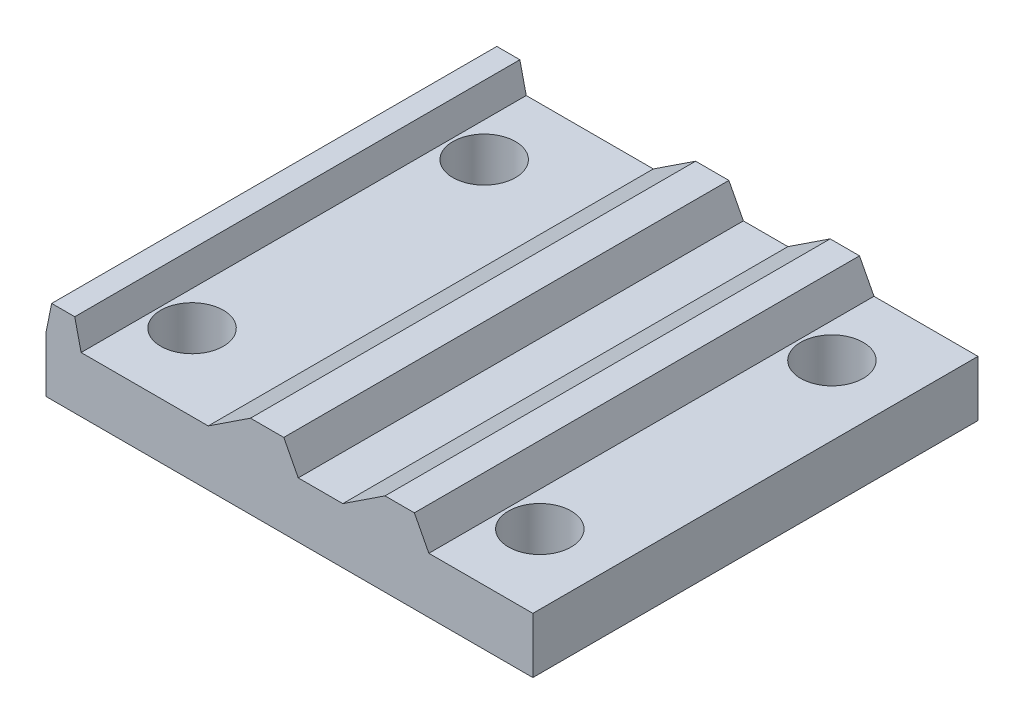
ISO-10303-21;
HEADER;
FILE_DESCRIPTION(('STEP AP214'),'2;1');
FILE_NAME('part.step','',(''),(''),'','','');
FILE_SCHEMA(('AUTOMOTIVE_DESIGN { 1 0 10303 214 1 1 1 1 }'));
ENDSEC;
DATA;
#1=APPLICATION_CONTEXT('core data for automotive mechanical design processes');
#2=APPLICATION_PROTOCOL_DEFINITION('international standard','automotive_design',2000,#1);
#3=PRODUCT_CONTEXT('',#1,'mechanical');
#4=PRODUCT('Part','Part','',(#3));
#5=PRODUCT_RELATED_PRODUCT_CATEGORY('part','',(#4));
#6=PRODUCT_DEFINITION_FORMATION('','',#4);
#7=PRODUCT_DEFINITION_CONTEXT('part definition',#1,'design');
#8=PRODUCT_DEFINITION('design','',#6,#7);
#9=PRODUCT_DEFINITION_SHAPE('','',#8);
#10=(LENGTH_UNIT() NAMED_UNIT(*) SI_UNIT(.MILLI.,.METRE.));
#11=(NAMED_UNIT(*) PLANE_ANGLE_UNIT() SI_UNIT($,.RADIAN.));
#12=(NAMED_UNIT(*) SI_UNIT($,.STERADIAN.) SOLID_ANGLE_UNIT());
#13=UNCERTAINTY_MEASURE_WITH_UNIT(LENGTH_MEASURE(1.E-05),#10,'distance_accuracy_value','');
#14=(GEOMETRIC_REPRESENTATION_CONTEXT(3) GLOBAL_UNCERTAINTY_ASSIGNED_CONTEXT((#13)) GLOBAL_UNIT_ASSIGNED_CONTEXT((#10,
#11,#12)) REPRESENTATION_CONTEXT('',''));
#15=CARTESIAN_POINT('',(0.,0.,0.));
#16=DIRECTION('',(0.,0.,1.));
#17=DIRECTION('',(1.,0.,0.));
#18=AXIS2_PLACEMENT_3D('',#15,#16,#17);
#19=CARTESIAN_POINT('',(0.,4.,0.));
#20=DIRECTION('',(0.,-1.,0.));
#21=DIRECTION('',(0.,0.,-1.));
#22=AXIS2_PLACEMENT_3D('',#19,#20,#21);
#23=PLANE('',#22);
#24=DIRECTION('',(0.,0.,1.));
#25=VECTOR('',#24,1.);
#26=CARTESIAN_POINT('',(3.83657922988963,4.,-22.7733539795888));
#27=LINE('',#26,#25);
#28=CARTESIAN_POINT('',(3.83657922988963,4.,-16.));
#29=VERTEX_POINT('',#28);
#30=CARTESIAN_POINT('',(3.83657922988963,4.,16.));
#31=VERTEX_POINT('',#30);
#32=EDGE_CURVE('E196',#29,#31,#27,.T.);
#33=ORIENTED_EDGE('',*,*,#32,.F.);
#34=DIRECTION('',(-1.,0.,0.));
#35=VECTOR('',#34,1.);
#36=CARTESIAN_POINT('',(-17.5,4.,-16.));
#37=LINE('',#36,#35);
#38=CARTESIAN_POINT('',(0.634129455362189,4.,-16.));
#39=VERTEX_POINT('',#38);
#40=EDGE_CURVE('E308',#29,#39,#37,.T.);
#41=ORIENTED_EDGE('',*,*,#40,.T.);
#42=DIRECTION('',(0.,0.,1.));
#43=VECTOR('',#42,1.);
#44=CARTESIAN_POINT('',(0.634129455362189,4.,-22.7733539795888));
#45=LINE('',#44,#43);
#46=CARTESIAN_POINT('',(0.63412945536219,4.,16.));
#47=VERTEX_POINT('',#46);
#48=EDGE_CURVE('E219',#39,#47,#45,.T.);
#49=ORIENTED_EDGE('',*,*,#48,.T.);
#50=DIRECTION('',(1.,0.,0.));
#51=VECTOR('',#50,1.);
#52=CARTESIAN_POINT('',(-17.5,4.,16.));
#53=LINE('',#52,#51);
#54=EDGE_CURVE('E313',#47,#31,#53,.T.);
#55=ORIENTED_EDGE('',*,*,#54,.T.);
#56=EDGE_LOOP('',(#33,#41,#49,#55));
#57=FACE_BOUND('',#56,.T.);
#58=ADVANCED_FACE('F48',(#57),#23,.F.);
#59=CARTESIAN_POINT('',(-12.5,4.,-10.5));
#60=DIRECTION('',(0.,1.,0.));
#61=DIRECTION('',(0.,0.,1.));
#62=AXIS2_PLACEMENT_3D('',#59,#60,#61);
#63=CIRCLE('',#62,2.25);
#64=CARTESIAN_POINT('',(-12.5,4.,-8.25));
#65=VERTEX_POINT('',#64);
#66=EDGE_CURVE('E289',#65,#65,#63,.T.);
#67=ORIENTED_EDGE('',*,*,#66,.F.);
#68=EDGE_LOOP('',(#67));
#69=FACE_BOUND('',#68,.T.);
#70=CARTESIAN_POINT('',(-12.5,4.,10.5));
#71=DIRECTION('',(0.,1.,0.));
#72=DIRECTION('',(0.,0.,-1.));
#73=AXIS2_PLACEMENT_3D('',#70,#71,#72);
#74=CIRCLE('',#73,2.25);
#75=CARTESIAN_POINT('',(-12.5,4.,8.25));
#76=VERTEX_POINT('',#75);
#77=EDGE_CURVE('E281',#76,#76,#74,.T.);
#78=ORIENTED_EDGE('',*,*,#77,.F.);
#79=EDGE_LOOP('',(#78));
#80=FACE_BOUND('',#79,.T.);
#81=DIRECTION('',(0.,0.,1.));
#82=VECTOR('',#81,1.);
#83=CARTESIAN_POINT('',(-5.83721693722193,4.,-22.7733539795888));
#84=LINE('',#83,#82);
#85=CARTESIAN_POINT('',(-5.83721693722193,4.,-16.));
#86=VERTEX_POINT('',#85);
#87=CARTESIAN_POINT('',(-5.83721693722193,4.,16.));
#88=VERTEX_POINT('',#87);
#89=EDGE_CURVE('E222',#86,#88,#84,.T.);
#90=ORIENTED_EDGE('',*,*,#89,.F.);
#91=CARTESIAN_POINT('',(-14.9752109843227,4.,-16.));
#92=VERTEX_POINT('',#91);
#93=EDGE_CURVE('E301',#86,#92,#37,.T.);
#94=ORIENTED_EDGE('',*,*,#93,.T.);
#95=DIRECTION('',(0.,0.,1.));
#96=VECTOR('',#95,1.);
#97=CARTESIAN_POINT('',(-14.9752109843227,4.,-22.7733539795888));
#98=LINE('',#97,#96);
#99=CARTESIAN_POINT('',(-14.9752109843227,4.,16.));
#100=VERTEX_POINT('',#99);
#101=EDGE_CURVE('E252',#92,#100,#98,.T.);
#102=ORIENTED_EDGE('',*,*,#101,.T.);
#103=EDGE_CURVE('E314',#100,#88,#53,.T.);
#104=ORIENTED_EDGE('',*,*,#103,.T.);
#105=EDGE_LOOP('',(#90,#94,#102,#104));
#106=FACE_BOUND('',#105,.T.);
#107=ADVANCED_FACE('F371',(#69,#80,#106),#23,.F.);
#108=CARTESIAN_POINT('',(17.5,4.,-16.));
#109=VERTEX_POINT('',#108);
#110=CARTESIAN_POINT('',(10.0231415723249,4.,-16.));
#111=VERTEX_POINT('',#110);
#112=EDGE_CURVE('E303',#109,#111,#37,.T.);
#113=ORIENTED_EDGE('',*,*,#112,.T.);
#114=DIRECTION('',(0.,0.,1.));
#115=VECTOR('',#114,1.);
#116=CARTESIAN_POINT('',(10.0231415723249,4.,-22.7733539795888));
#117=LINE('',#116,#115);
#118=CARTESIAN_POINT('',(10.0231415723249,4.,16.));
#119=VERTEX_POINT('',#118);
#120=EDGE_CURVE('E192',#111,#119,#117,.T.);
#121=ORIENTED_EDGE('',*,*,#120,.T.);
#122=CARTESIAN_POINT('',(17.5,4.,16.));
#123=VERTEX_POINT('',#122);
#124=EDGE_CURVE('E179',#119,#123,#53,.T.);
#125=ORIENTED_EDGE('',*,*,#124,.T.);
#126=DIRECTION('',(0.,0.,-1.));
#127=VECTOR('',#126,1.);
#128=CARTESIAN_POINT('',(17.5,4.,16.));
#129=LINE('',#128,#127);
#130=EDGE_CURVE('E297',#123,#109,#129,.T.);
#131=ORIENTED_EDGE('',*,*,#130,.T.);
#132=EDGE_LOOP('',(#113,#121,#125,#131));
#133=FACE_BOUND('',#132,.T.);
#134=CARTESIAN_POINT('',(12.5,4.,10.5));
#135=DIRECTION('',(0.,1.,0.));
#136=DIRECTION('',(0.,0.,1.));
#137=AXIS2_PLACEMENT_3D('',#134,#135,#136);
#138=CIRCLE('',#137,2.25);
#139=CARTESIAN_POINT('',(12.5,4.,12.75));
#140=VERTEX_POINT('',#139);
#141=EDGE_CURVE('E273',#140,#140,#138,.T.);
#142=ORIENTED_EDGE('',*,*,#141,.F.);
#143=EDGE_LOOP('',(#142));
#144=FACE_BOUND('',#143,.T.);
#145=CARTESIAN_POINT('',(12.5,4.,-10.5));
#146=DIRECTION('',(0.,1.,0.));
#147=DIRECTION('',(0.,0.,-1.));
#148=AXIS2_PLACEMENT_3D('',#145,#146,#147);
#149=CIRCLE('',#148,2.25);
#150=CARTESIAN_POINT('',(12.5,4.,-12.75));
#151=VERTEX_POINT('',#150);
#152=EDGE_CURVE('E264',#151,#151,#149,.T.);
#153=ORIENTED_EDGE('',*,*,#152,.F.);
#154=EDGE_LOOP('',(#153));
#155=FACE_BOUND('',#154,.T.);
#156=ADVANCED_FACE('F352',(#133,#144,#155),#23,.F.);
#157=CARTESIAN_POINT('',(0.,0.,0.));
#158=DIRECTION('',(0.,-1.,0.));
#159=DIRECTION('',(0.,0.,-1.));
#160=AXIS2_PLACEMENT_3D('',#157,#158,#159);
#161=PLANE('',#160);
#162=CARTESIAN_POINT('',(12.5,0.,10.5));
#163=DIRECTION('',(0.,1.,0.));
#164=DIRECTION('',(0.,0.,1.));
#165=AXIS2_PLACEMENT_3D('',#162,#163,#164);
#166=CIRCLE('',#165,2.25);
#167=CARTESIAN_POINT('',(12.5,0.,12.75));
#168=VERTEX_POINT('',#167);
#169=EDGE_CURVE('E268',#168,#168,#166,.T.);
#170=ORIENTED_EDGE('',*,*,#169,.T.);
#171=EDGE_LOOP('',(#170));
#172=FACE_BOUND('',#171,.T.);
#173=CARTESIAN_POINT('',(-12.5,0.,-10.5));
#174=DIRECTION('',(0.,1.,0.));
#175=DIRECTION('',(0.,0.,1.));
#176=AXIS2_PLACEMENT_3D('',#173,#174,#175);
#177=CIRCLE('',#176,2.25);
#178=CARTESIAN_POINT('',(-12.5,0.,-8.25));
#179=VERTEX_POINT('',#178);
#180=EDGE_CURVE('E285',#179,#179,#177,.T.);
#181=ORIENTED_EDGE('',*,*,#180,.T.);
#182=EDGE_LOOP('',(#181));
#183=FACE_BOUND('',#182,.T.);
#184=DIRECTION('',(0.,0.,-1.));
#185=VECTOR('',#184,1.);
#186=CARTESIAN_POINT('',(17.5,0.,16.));
#187=LINE('',#186,#185);
#188=CARTESIAN_POINT('',(17.5,0.,16.));
#189=VERTEX_POINT('',#188);
#190=CARTESIAN_POINT('',(17.5,0.,-16.));
#191=VERTEX_POINT('',#190);
#192=EDGE_CURVE('E293',#189,#191,#187,.T.);
#193=ORIENTED_EDGE('',*,*,#192,.F.);
#194=DIRECTION('',(1.,0.,0.));
#195=VECTOR('',#194,1.);
#196=CARTESIAN_POINT('',(-17.5,0.,16.));
#197=LINE('',#196,#195);
#198=CARTESIAN_POINT('',(-17.5,0.,16.));
#199=VERTEX_POINT('',#198);
#200=EDGE_CURVE('E302',#199,#189,#197,.T.);
#201=ORIENTED_EDGE('',*,*,#200,.F.);
#202=DIRECTION('',(0.,0.,1.));
#203=VECTOR('',#202,1.);
#204=CARTESIAN_POINT('',(-17.5,0.,16.));
#205=LINE('',#204,#203);
#206=CARTESIAN_POINT('',(-17.5,0.,-16.));
#207=VERTEX_POINT('',#206);
#208=EDGE_CURVE('E321',#207,#199,#205,.T.);
#209=ORIENTED_EDGE('',*,*,#208,.F.);
#210=DIRECTION('',(-1.,0.,0.));
#211=VECTOR('',#210,1.);
#212=CARTESIAN_POINT('',(-17.5,0.,-16.));
#213=LINE('',#212,#211);
#214=EDGE_CURVE('E318',#191,#207,#213,.T.);
#215=ORIENTED_EDGE('',*,*,#214,.F.);
#216=EDGE_LOOP('',(#193,#201,#209,#215));
#217=FACE_BOUND('',#216,.T.);
#218=CARTESIAN_POINT('',(-12.5,0.,10.5));
#219=DIRECTION('',(0.,1.,0.));
#220=DIRECTION('',(0.,0.,-1.));
#221=AXIS2_PLACEMENT_3D('',#218,#219,#220);
#222=CIRCLE('',#221,2.25);
#223=CARTESIAN_POINT('',(-12.5,0.,8.25));
#224=VERTEX_POINT('',#223);
#225=EDGE_CURVE('E277',#224,#224,#222,.T.);
#226=ORIENTED_EDGE('',*,*,#225,.T.);
#227=EDGE_LOOP('',(#226));
#228=FACE_BOUND('',#227,.T.);
#229=CARTESIAN_POINT('',(12.5,0.,-10.5));
#230=DIRECTION('',(0.,1.,0.));
#231=DIRECTION('',(0.,0.,-1.));
#232=AXIS2_PLACEMENT_3D('',#229,#230,#231);
#233=CIRCLE('',#232,2.25);
#234=CARTESIAN_POINT('',(12.5,0.,-12.75));
#235=VERTEX_POINT('',#234);
#236=EDGE_CURVE('E269',#235,#235,#233,.T.);
#237=ORIENTED_EDGE('',*,*,#236,.T.);
#238=EDGE_LOOP('',(#237));
#239=FACE_BOUND('',#238,.T.);
#240=ADVANCED_FACE('F345',(#172,#183,#217,#228,#239),#161,.T.);
#241=CARTESIAN_POINT('',(17.5,4.,16.));
#242=DIRECTION('',(-1.,0.,0.));
#243=DIRECTION('',(0.,0.,1.));
#244=AXIS2_PLACEMENT_3D('',#241,#242,#243);
#245=PLANE('',#244);
#246=ORIENTED_EDGE('',*,*,#192,.T.);
#247=DIRECTION('',(0.,-1.,0.));
#248=VECTOR('',#247,1.);
#249=CARTESIAN_POINT('',(17.5,4.,-16.));
#250=LINE('',#249,#248);
#251=EDGE_CURVE('E11',#109,#191,#250,.T.);
#252=ORIENTED_EDGE('',*,*,#251,.F.);
#253=ORIENTED_EDGE('',*,*,#130,.F.);
#254=DIRECTION('',(0.,-1.,0.));
#255=VECTOR('',#254,1.);
#256=CARTESIAN_POINT('',(17.5,4.,16.));
#257=LINE('',#256,#255);
#258=EDGE_CURVE('E326',#123,#189,#257,.T.);
#259=ORIENTED_EDGE('',*,*,#258,.T.);
#260=EDGE_LOOP('',(#246,#252,#253,#259));
#261=FACE_BOUND('',#260,.T.);
#262=ADVANCED_FACE('F50',(#261),#245,.F.);
#263=CARTESIAN_POINT('',(-17.5,4.,-16.));
#264=DIRECTION('',(0.,0.,1.));
#265=DIRECTION('',(1.,0.,0.));
#266=AXIS2_PLACEMENT_3D('',#263,#264,#265);
#267=PLANE('',#266);
#268=ORIENTED_EDGE('',*,*,#214,.T.);
#269=DIRECTION('',(0.,-1.,0.));
#270=VECTOR('',#269,1.);
#271=CARTESIAN_POINT('',(-17.5,4.,-16.));
#272=LINE('',#271,#270);
#273=CARTESIAN_POINT('',(-17.5,4.,-16.));
#274=VERTEX_POINT('',#273);
#275=EDGE_CURVE('E57',#274,#207,#272,.T.);
#276=ORIENTED_EDGE('',*,*,#275,.F.);
#277=DIRECTION('',(-0.199963550905367,-0.979803336547348,0.));
#278=VECTOR('',#277,1.);
#279=CARTESIAN_POINT('',(-17.5839549378728,3.58862838814909,-16.));
#280=LINE('',#279,#278);
#281=CARTESIAN_POINT('',(-17.0918292101148,6.,-16.));
#282=VERTEX_POINT('',#281);
#283=EDGE_CURVE('E233',#282,#274,#280,.T.);
#284=ORIENTED_EDGE('',*,*,#283,.F.);
#285=DIRECTION('',(-1.,0.,0.));
#286=VECTOR('',#285,1.);
#287=CARTESIAN_POINT('',(0.,6.,-16.));
#288=LINE('',#287,#286);
#289=CARTESIAN_POINT('',(-15.4333367883982,6.,-16.));
#290=VERTEX_POINT('',#289);
#291=EDGE_CURVE('E236',#290,#282,#288,.T.);
#292=ORIENTED_EDGE('',*,*,#291,.F.);
#293=DIRECTION('',(-0.223280057045609,0.974754336294899,0.));
#294=VECTOR('',#293,1.);
#295=CARTESIAN_POINT('',(-13.3580642421427,-3.05983696091214,-16.));
#296=LINE('',#295,#294);
#297=EDGE_CURVE('E210',#92,#290,#296,.T.);
#298=ORIENTED_EDGE('',*,*,#297,.F.);
#299=ORIENTED_EDGE('',*,*,#93,.F.);
#300=DIRECTION('',(-0.835107840595722,-0.550086261031441,0.));
#301=VECTOR('',#300,1.);
#302=CARTESIAN_POINT('',(-3.60383744209866,5.47112901617624,-16.));
#303=LINE('',#302,#301);
#304=CARTESIAN_POINT('',(-2.80093735797976,6.,-16.));
#305=VERTEX_POINT('',#304);
#306=EDGE_CURVE('E185',#305,#86,#303,.T.);
#307=ORIENTED_EDGE('',*,*,#306,.F.);
#308=DIRECTION('',(-1.,0.,0.));
#309=VECTOR('',#308,1.);
#310=CARTESIAN_POINT('',(0.,6.,-16.));
#311=LINE('',#310,#309);
#312=CARTESIAN_POINT('',(-0.407144499746946,6.,-16.));
#313=VERTEX_POINT('',#312);
#314=EDGE_CURVE('E205',#313,#305,#311,.T.);
#315=ORIENTED_EDGE('',*,*,#314,.F.);
#316=DIRECTION('',(-0.461797412471633,0.886985428197389,0.));
#317=VECTOR('',#316,1.);
#318=CARTESIAN_POINT('',(2.13732730768088,1.11277162951581,-16.));
#319=LINE('',#318,#317);
#320=EDGE_CURVE('E181',#39,#313,#319,.T.);
#321=ORIENTED_EDGE('',*,*,#320,.F.);
#322=ORIENTED_EDGE('',*,*,#40,.F.);
#323=DIRECTION('',(-0.835107840595722,-0.550086261031441,0.));
#324=VECTOR('',#323,1.);
#325=CARTESIAN_POINT('',(-0.676596110766165,1.02716747725699,-16.));
#326=LINE('',#325,#324);
#327=CARTESIAN_POINT('',(6.8728588091318,6.,-16.));
#328=VERTEX_POINT('',#327);
#329=EDGE_CURVE('E203',#328,#29,#326,.T.);
#330=ORIENTED_EDGE('',*,*,#329,.F.);
#331=DIRECTION('',(-1.,0.,0.));
#332=VECTOR('',#331,1.);
#333=CARTESIAN_POINT('',(0.,6.,-16.));
#334=LINE('',#333,#332);
#335=CARTESIAN_POINT('',(8.98186761721576,6.,-16.));
#336=VERTEX_POINT('',#335);
#337=EDGE_CURVE('E195',#336,#328,#334,.T.);
#338=ORIENTED_EDGE('',*,*,#337,.F.);
#339=DIRECTION('',(-0.461797412471633,0.886985428197389,0.));
#340=VECTOR('',#339,1.);
#341=CARTESIAN_POINT('',(9.52406827441444,4.95858212041449,-16.));
#342=LINE('',#341,#340);
#343=EDGE_CURVE('E160',#111,#336,#342,.T.);
#344=ORIENTED_EDGE('',*,*,#343,.F.);
#345=ORIENTED_EDGE('',*,*,#112,.F.);
#346=ORIENTED_EDGE('',*,*,#251,.T.);
#347=EDGE_LOOP('',(#268,#276,#284,#292,#298,#299,#307,#315,#321,#322,#330,#338,#344,#345,#346));
#348=FACE_BOUND('',#347,.T.);
#349=ADVANCED_FACE('F354',(#348),#267,.F.);
#350=CARTESIAN_POINT('',(-17.5,4.,16.));
#351=DIRECTION('',(1.,0.,0.));
#352=DIRECTION('',(0.,0.,-1.));
#353=AXIS2_PLACEMENT_3D('',#350,#351,#352);
#354=PLANE('',#353);
#355=ORIENTED_EDGE('',*,*,#208,.T.);
#356=DIRECTION('',(0.,-1.,0.));
#357=VECTOR('',#356,1.);
#358=CARTESIAN_POINT('',(-17.5,4.,16.));
#359=LINE('',#358,#357);
#360=CARTESIAN_POINT('',(-17.5,4.,16.));
#361=VERTEX_POINT('',#360);
#362=EDGE_CURVE('E330',#361,#199,#359,.T.);
#363=ORIENTED_EDGE('',*,*,#362,.F.);
#364=DIRECTION('',(0.,0.,1.));
#365=VECTOR('',#364,1.);
#366=CARTESIAN_POINT('',(-17.5,4.,16.));
#367=LINE('',#366,#365);
#368=EDGE_CURVE('E307',#274,#361,#367,.T.);
#369=ORIENTED_EDGE('',*,*,#368,.F.);
#370=ORIENTED_EDGE('',*,*,#275,.T.);
#371=EDGE_LOOP('',(#355,#363,#369,#370));
#372=FACE_BOUND('',#371,.T.);
#373=ADVANCED_FACE('F339',(#372),#354,.F.);
#374=CARTESIAN_POINT('',(-17.5,4.,16.));
#375=DIRECTION('',(0.,0.,-1.));
#376=DIRECTION('',(-1.,0.,0.));
#377=AXIS2_PLACEMENT_3D('',#374,#375,#376);
#378=PLANE('',#377);
#379=ORIENTED_EDGE('',*,*,#200,.T.);
#380=ORIENTED_EDGE('',*,*,#258,.F.);
#381=ORIENTED_EDGE('',*,*,#124,.F.);
#382=DIRECTION('',(0.461797412471633,-0.886985428197389,0.));
#383=VECTOR('',#382,1.);
#384=CARTESIAN_POINT('',(9.52406827441444,4.95858212041449,16.));
#385=LINE('',#384,#383);
#386=CARTESIAN_POINT('',(8.98186761721576,6.,16.));
#387=VERTEX_POINT('',#386);
#388=EDGE_CURVE('E64',#387,#119,#385,.T.);
#389=ORIENTED_EDGE('',*,*,#388,.F.);
#390=DIRECTION('',(1.,0.,0.));
#391=VECTOR('',#390,1.);
#392=CARTESIAN_POINT('',(0.,6.,16.));
#393=LINE('',#392,#391);
#394=CARTESIAN_POINT('',(6.8728588091318,6.,16.));
#395=VERTEX_POINT('',#394);
#396=EDGE_CURVE('E168',#395,#387,#393,.T.);
#397=ORIENTED_EDGE('',*,*,#396,.F.);
#398=DIRECTION('',(0.835107840595722,0.550086261031441,0.));
#399=VECTOR('',#398,1.);
#400=CARTESIAN_POINT('',(-0.676596110766165,1.02716747725699,16.));
#401=LINE('',#400,#399);
#402=EDGE_CURVE('E165',#31,#395,#401,.T.);
#403=ORIENTED_EDGE('',*,*,#402,.F.);
#404=ORIENTED_EDGE('',*,*,#54,.F.);
#405=DIRECTION('',(0.461797412471633,-0.886985428197389,0.));
#406=VECTOR('',#405,1.);
#407=CARTESIAN_POINT('',(2.13732730768088,1.11277162951581,16.));
#408=LINE('',#407,#406);
#409=CARTESIAN_POINT('',(-0.407144499746946,6.,16.));
#410=VERTEX_POINT('',#409);
#411=EDGE_CURVE('E72',#410,#47,#408,.T.);
#412=ORIENTED_EDGE('',*,*,#411,.F.);
#413=DIRECTION('',(1.,0.,0.));
#414=VECTOR('',#413,1.);
#415=CARTESIAN_POINT('',(0.,6.,16.));
#416=LINE('',#415,#414);
#417=CARTESIAN_POINT('',(-2.80093735797976,6.,16.));
#418=VERTEX_POINT('',#417);
#419=EDGE_CURVE('E209',#418,#410,#416,.T.);
#420=ORIENTED_EDGE('',*,*,#419,.F.);
#421=DIRECTION('',(0.835107840595722,0.550086261031441,0.));
#422=VECTOR('',#421,1.);
#423=CARTESIAN_POINT('',(-3.60383744209866,5.47112901617624,16.));
#424=LINE('',#423,#422);
#425=EDGE_CURVE('E214',#88,#418,#424,.T.);
#426=ORIENTED_EDGE('',*,*,#425,.F.);
#427=ORIENTED_EDGE('',*,*,#103,.F.);
#428=DIRECTION('',(0.223280057045609,-0.974754336294899,0.));
#429=VECTOR('',#428,1.);
#430=CARTESIAN_POINT('',(-13.3580642421427,-3.05983696091214,16.));
#431=LINE('',#430,#429);
#432=CARTESIAN_POINT('',(-15.4333367883982,6.,16.));
#433=VERTEX_POINT('',#432);
#434=EDGE_CURVE('E240',#433,#100,#431,.T.);
#435=ORIENTED_EDGE('',*,*,#434,.F.);
#436=DIRECTION('',(1.,0.,0.));
#437=VECTOR('',#436,1.);
#438=CARTESIAN_POINT('',(0.,6.,16.));
#439=LINE('',#438,#437);
#440=CARTESIAN_POINT('',(-17.0918292101148,6.,16.));
#441=VERTEX_POINT('',#440);
#442=EDGE_CURVE('E243',#441,#433,#439,.T.);
#443=ORIENTED_EDGE('',*,*,#442,.F.);
#444=DIRECTION('',(0.199963550905367,0.979803336547348,0.));
#445=VECTOR('',#444,1.);
#446=CARTESIAN_POINT('',(-17.5839549378728,3.58862838814909,16.));
#447=LINE('',#446,#445);
#448=EDGE_CURVE('E247',#361,#441,#447,.T.);
#449=ORIENTED_EDGE('',*,*,#448,.F.);
#450=ORIENTED_EDGE('',*,*,#362,.T.);
#451=EDGE_LOOP('',(#379,#380,#381,#389,#397,#403,#404,#412,#420,#426,#427,#435,#443,#449,#450));
#452=FACE_BOUND('',#451,.T.);
#453=ADVANCED_FACE('F177',(#452),#378,.F.);
#454=CARTESIAN_POINT('',(-12.5,4.,-10.5));
#455=DIRECTION('',(0.,-1.,0.));
#456=DIRECTION('',(0.,0.,-1.));
#457=AXIS2_PLACEMENT_3D('',#454,#455,#456);
#458=CYLINDRICAL_SURFACE('',#457,2.25);
#459=ORIENTED_EDGE('',*,*,#66,.T.);
#460=EDGE_LOOP('',(#459));
#461=FACE_BOUND('',#460,.T.);
#462=ORIENTED_EDGE('',*,*,#180,.F.);
#463=EDGE_LOOP('',(#462));
#464=FACE_BOUND('',#463,.T.);
#465=ADVANCED_FACE('F421',(#461,#464),#458,.F.);
#466=CARTESIAN_POINT('',(-12.5,4.,10.5));
#467=DIRECTION('',(0.,-1.,0.));
#468=DIRECTION('',(0.,0.,-1.));
#469=AXIS2_PLACEMENT_3D('',#466,#467,#468);
#470=CYLINDRICAL_SURFACE('',#469,2.25);
#471=ORIENTED_EDGE('',*,*,#77,.T.);
#472=EDGE_LOOP('',(#471));
#473=FACE_BOUND('',#472,.T.);
#474=ORIENTED_EDGE('',*,*,#225,.F.);
#475=EDGE_LOOP('',(#474));
#476=FACE_BOUND('',#475,.T.);
#477=ADVANCED_FACE('F443',(#473,#476),#470,.F.);
#478=CARTESIAN_POINT('',(12.5,4.,10.5));
#479=DIRECTION('',(0.,-1.,0.));
#480=DIRECTION('',(0.,0.,-1.));
#481=AXIS2_PLACEMENT_3D('',#478,#479,#480);
#482=CYLINDRICAL_SURFACE('',#481,2.25);
#483=ORIENTED_EDGE('',*,*,#141,.T.);
#484=EDGE_LOOP('',(#483));
#485=FACE_BOUND('',#484,.T.);
#486=ORIENTED_EDGE('',*,*,#169,.F.);
#487=EDGE_LOOP('',(#486));
#488=FACE_BOUND('',#487,.T.);
#489=ADVANCED_FACE('F450',(#485,#488),#482,.F.);
#490=CARTESIAN_POINT('',(12.5,4.,-10.5));
#491=DIRECTION('',(0.,-1.,0.));
#492=DIRECTION('',(0.,0.,-1.));
#493=AXIS2_PLACEMENT_3D('',#490,#491,#492);
#494=CYLINDRICAL_SURFACE('',#493,2.25);
#495=ORIENTED_EDGE('',*,*,#152,.T.);
#496=EDGE_LOOP('',(#495));
#497=FACE_BOUND('',#496,.T.);
#498=ORIENTED_EDGE('',*,*,#236,.F.);
#499=EDGE_LOOP('',(#498));
#500=FACE_BOUND('',#499,.T.);
#501=ADVANCED_FACE('F458',(#497,#500),#494,.F.);
#502=CARTESIAN_POINT('',(0.,6.,-22.7733539795888));
#503=DIRECTION('',(0.,-1.,0.));
#504=DIRECTION('',(0.,0.,-1.));
#505=AXIS2_PLACEMENT_3D('',#502,#503,#504);
#506=PLANE('',#505);
#507=DIRECTION('',(0.,0.,1.));
#508=VECTOR('',#507,1.);
#509=CARTESIAN_POINT('',(-15.4333367883982,6.,-22.7733539795888));
#510=LINE('',#509,#508);
#511=EDGE_CURVE('E251',#290,#433,#510,.T.);
#512=ORIENTED_EDGE('',*,*,#511,.F.);
#513=ORIENTED_EDGE('',*,*,#291,.T.);
#514=DIRECTION('',(0.,0.,1.));
#515=VECTOR('',#514,1.);
#516=CARTESIAN_POINT('',(-17.0918292101148,6.,-22.7733539795888));
#517=LINE('',#516,#515);
#518=EDGE_CURVE('E256',#282,#441,#517,.T.);
#519=ORIENTED_EDGE('',*,*,#518,.T.);
#520=ORIENTED_EDGE('',*,*,#442,.T.);
#521=EDGE_LOOP('',(#512,#513,#519,#520));
#522=FACE_BOUND('',#521,.T.);
#523=ADVANCED_FACE('F466',(#522),#506,.F.);
#524=CARTESIAN_POINT('',(-17.5839549378728,3.58862838814909,-22.7733539795888));
#525=DIRECTION('',(0.979803336547348,-0.199963550905367,0.));
#526=DIRECTION('',(0.199963550905367,0.979803336547348,0.));
#527=AXIS2_PLACEMENT_3D('',#524,#525,#526);
#528=PLANE('',#527);
#529=ORIENTED_EDGE('',*,*,#518,.F.);
#530=ORIENTED_EDGE('',*,*,#283,.T.);
#531=ORIENTED_EDGE('',*,*,#368,.T.);
#532=ORIENTED_EDGE('',*,*,#448,.T.);
#533=EDGE_LOOP('',(#529,#530,#531,#532));
#534=FACE_BOUND('',#533,.T.);
#535=ADVANCED_FACE('F473',(#534),#528,.F.);
#536=CARTESIAN_POINT('',(-13.3580642421427,-3.05983696091214,-22.7733539795888));
#537=DIRECTION('',(-0.974754336294899,-0.223280057045609,0.));
#538=DIRECTION('',(0.223280057045609,-0.974754336294899,0.));
#539=AXIS2_PLACEMENT_3D('',#536,#537,#538);
#540=PLANE('',#539);
#541=ORIENTED_EDGE('',*,*,#101,.F.);
#542=ORIENTED_EDGE('',*,*,#297,.T.);
#543=ORIENTED_EDGE('',*,*,#511,.T.);
#544=ORIENTED_EDGE('',*,*,#434,.T.);
#545=EDGE_LOOP('',(#541,#542,#543,#544));
#546=FACE_BOUND('',#545,.T.);
#547=ADVANCED_FACE('F378',(#546),#540,.F.);
#548=CARTESIAN_POINT('',(0.,6.,-22.7733539795888));
#549=DIRECTION('',(0.,-1.,0.));
#550=DIRECTION('',(0.,0.,-1.));
#551=AXIS2_PLACEMENT_3D('',#548,#549,#550);
#552=PLANE('',#551);
#553=DIRECTION('',(0.,0.,1.));
#554=VECTOR('',#553,1.);
#555=CARTESIAN_POINT('',(-0.407144499746946,6.,-22.7733539795888));
#556=LINE('',#555,#554);
#557=EDGE_CURVE('E218',#313,#410,#556,.T.);
#558=ORIENTED_EDGE('',*,*,#557,.F.);
#559=ORIENTED_EDGE('',*,*,#314,.T.);
#560=DIRECTION('',(0.,0.,1.));
#561=VECTOR('',#560,1.);
#562=CARTESIAN_POINT('',(-2.80093735797976,6.,-22.7733539795888));
#563=LINE('',#562,#561);
#564=EDGE_CURVE('E225',#305,#418,#563,.T.);
#565=ORIENTED_EDGE('',*,*,#564,.T.);
#566=ORIENTED_EDGE('',*,*,#419,.T.);
#567=EDGE_LOOP('',(#558,#559,#565,#566));
#568=FACE_BOUND('',#567,.T.);
#569=ADVANCED_FACE('F389',(#568),#552,.F.);
#570=CARTESIAN_POINT('',(-3.60383744209866,5.47112901617624,-22.7733539795888));
#571=DIRECTION('',(0.550086261031441,-0.835107840595722,0.));
#572=DIRECTION('',(0.835107840595722,0.550086261031441,0.));
#573=AXIS2_PLACEMENT_3D('',#570,#571,#572);
#574=PLANE('',#573);
#575=ORIENTED_EDGE('',*,*,#564,.F.);
#576=ORIENTED_EDGE('',*,*,#306,.T.);
#577=ORIENTED_EDGE('',*,*,#89,.T.);
#578=ORIENTED_EDGE('',*,*,#425,.T.);
#579=EDGE_LOOP('',(#575,#576,#577,#578));
#580=FACE_BOUND('',#579,.T.);
#581=ADVANCED_FACE('F386',(#580),#574,.F.);
#582=CARTESIAN_POINT('',(2.13732730768088,1.11277162951581,-22.7733539795888));
#583=DIRECTION('',(-0.886985428197389,-0.461797412471632,0.));
#584=DIRECTION('',(0.461797412471633,-0.886985428197389,0.));
#585=AXIS2_PLACEMENT_3D('',#582,#583,#584);
#586=PLANE('',#585);
#587=ORIENTED_EDGE('',*,*,#48,.F.);
#588=ORIENTED_EDGE('',*,*,#320,.T.);
#589=ORIENTED_EDGE('',*,*,#557,.T.);
#590=ORIENTED_EDGE('',*,*,#411,.T.);
#591=EDGE_LOOP('',(#587,#588,#589,#590));
#592=FACE_BOUND('',#591,.T.);
#593=ADVANCED_FACE('F390',(#592),#586,.F.);
#594=CARTESIAN_POINT('',(0.,6.,-22.7733539795888));
#595=DIRECTION('',(0.,-1.,0.));
#596=DIRECTION('',(0.,0.,-1.));
#597=AXIS2_PLACEMENT_3D('',#594,#595,#596);
#598=PLANE('',#597);
#599=DIRECTION('',(0.,0.,1.));
#600=VECTOR('',#599,1.);
#601=CARTESIAN_POINT('',(8.98186761721576,6.,-22.7733539795888));
#602=LINE('',#601,#600);
#603=EDGE_CURVE('E157',#336,#387,#602,.T.);
#604=ORIENTED_EDGE('',*,*,#603,.F.);
#605=ORIENTED_EDGE('',*,*,#337,.T.);
#606=DIRECTION('',(0.,0.,1.));
#607=VECTOR('',#606,1.);
#608=CARTESIAN_POINT('',(6.8728588091318,6.,-22.7733539795888));
#609=LINE('',#608,#607);
#610=EDGE_CURVE('E164',#328,#395,#609,.T.);
#611=ORIENTED_EDGE('',*,*,#610,.T.);
#612=ORIENTED_EDGE('',*,*,#396,.T.);
#613=EDGE_LOOP('',(#604,#605,#611,#612));
#614=FACE_BOUND('',#613,.T.);
#615=ADVANCED_FACE('F169',(#614),#598,.F.);
#616=CARTESIAN_POINT('',(-0.676596110766165,1.02716747725699,-22.7733539795888));
#617=DIRECTION('',(0.550086261031441,-0.835107840595722,0.));
#618=DIRECTION('',(0.835107840595722,0.550086261031441,0.));
#619=AXIS2_PLACEMENT_3D('',#616,#617,#618);
#620=PLANE('',#619);
#621=ORIENTED_EDGE('',*,*,#610,.F.);
#622=ORIENTED_EDGE('',*,*,#329,.T.);
#623=ORIENTED_EDGE('',*,*,#32,.T.);
#624=ORIENTED_EDGE('',*,*,#402,.T.);
#625=EDGE_LOOP('',(#621,#622,#623,#624));
#626=FACE_BOUND('',#625,.T.);
#627=ADVANCED_FACE('F359',(#626),#620,.F.);
#628=CARTESIAN_POINT('',(9.52406827441444,4.95858212041449,-22.7733539795888));
#629=DIRECTION('',(-0.886985428197388,-0.461797412471633,0.));
#630=DIRECTION('',(0.461797412471633,-0.886985428197389,0.));
#631=AXIS2_PLACEMENT_3D('',#628,#629,#630);
#632=PLANE('',#631);
#633=ORIENTED_EDGE('',*,*,#120,.F.);
#634=ORIENTED_EDGE('',*,*,#343,.T.);
#635=ORIENTED_EDGE('',*,*,#603,.T.);
#636=ORIENTED_EDGE('',*,*,#388,.T.);
#637=EDGE_LOOP('',(#633,#634,#635,#636));
#638=FACE_BOUND('',#637,.T.);
#639=ADVANCED_FACE('F159',(#638),#632,.F.);
#640=CLOSED_SHELL('',(#58,#107,#156,#240,#262,#349,#373,#453,#465,#477,#489,#501,#523,#535,#547,
#569,#581,#593,#615,#627,#639));
#641=MANIFOLD_SOLID_BREP('B2',#640);
#642=ADVANCED_BREP_SHAPE_REPRESENTATION('',(#18,#641),#14);
#643=SHAPE_DEFINITION_REPRESENTATION(#9,#642);
ENDSEC;
END-ISO-10303-21;
